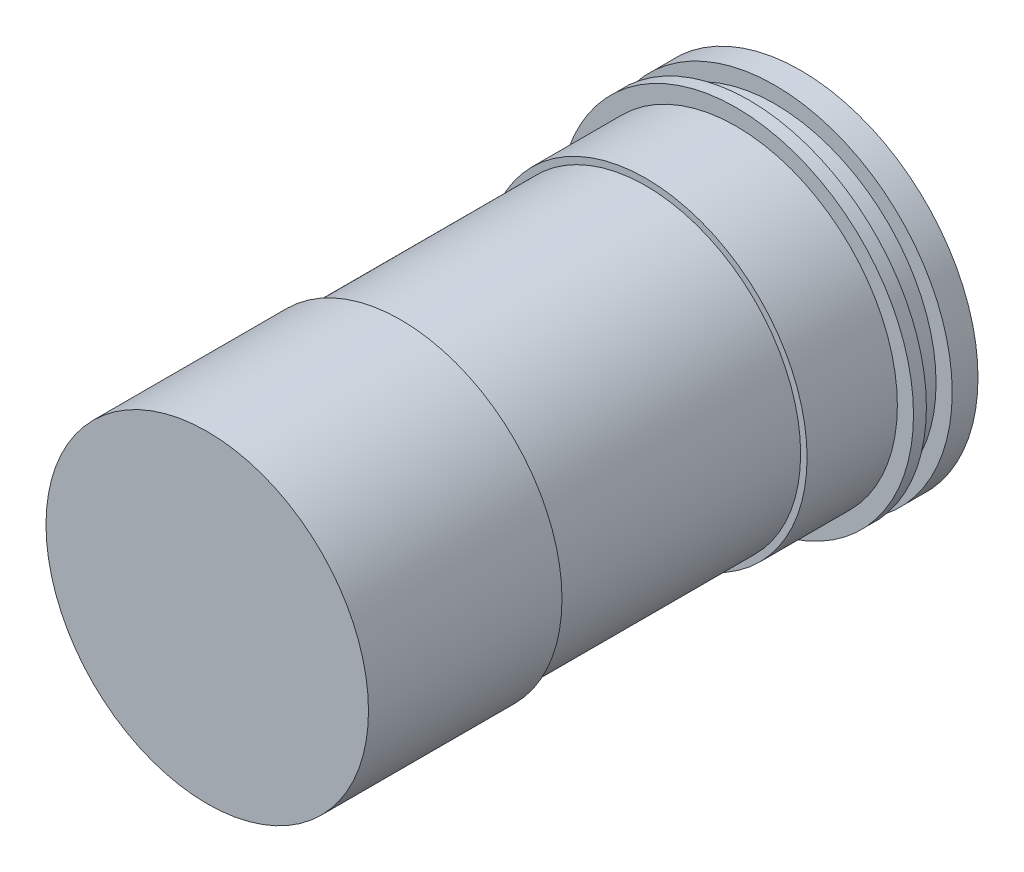
ISO-10303-21;
HEADER;
FILE_DESCRIPTION(('STEP AP214'),'2;1');
FILE_NAME('part.step','',(''),(''),'','','');
FILE_SCHEMA(('AUTOMOTIVE_DESIGN { 1 0 10303 214 1 1 1 1 }'));
ENDSEC;
DATA;
#1=APPLICATION_CONTEXT('core data for automotive mechanical design processes');
#2=APPLICATION_PROTOCOL_DEFINITION('international standard','automotive_design',2000,#1);
#3=PRODUCT_CONTEXT('',#1,'mechanical');
#4=PRODUCT('Part','Part','',(#3));
#5=PRODUCT_RELATED_PRODUCT_CATEGORY('part','',(#4));
#6=PRODUCT_DEFINITION_FORMATION('','',#4);
#7=PRODUCT_DEFINITION_CONTEXT('part definition',#1,'design');
#8=PRODUCT_DEFINITION('design','',#6,#7);
#9=PRODUCT_DEFINITION_SHAPE('','',#8);
#10=(LENGTH_UNIT() NAMED_UNIT(*) SI_UNIT(.MILLI.,.METRE.));
#11=(NAMED_UNIT(*) PLANE_ANGLE_UNIT() SI_UNIT($,.RADIAN.));
#12=(NAMED_UNIT(*) SI_UNIT($,.STERADIAN.) SOLID_ANGLE_UNIT());
#13=UNCERTAINTY_MEASURE_WITH_UNIT(LENGTH_MEASURE(1.E-05),#10,'distance_accuracy_value','');
#14=(GEOMETRIC_REPRESENTATION_CONTEXT(3) GLOBAL_UNCERTAINTY_ASSIGNED_CONTEXT((#13)) GLOBAL_UNIT_ASSIGNED_CONTEXT((#10,
#11,#12)) REPRESENTATION_CONTEXT('',''));
#15=CARTESIAN_POINT('',(0.,0.,0.));
#16=DIRECTION('',(0.,0.,1.));
#17=DIRECTION('',(1.,0.,0.));
#18=AXIS2_PLACEMENT_3D('',#15,#16,#17);
#19=CARTESIAN_POINT('',(0.,0.,3.5));
#20=DIRECTION('',(0.,0.,-1.));
#21=DIRECTION('',(-1.,0.,0.));
#22=AXIS2_PLACEMENT_3D('',#19,#20,#21);
#23=CYLINDRICAL_SURFACE('',#22,12.5);
#24=CARTESIAN_POINT('',(0.,0.,3.5));
#25=DIRECTION('',(0.,0.,1.));
#26=DIRECTION('',(1.,0.,0.));
#27=AXIS2_PLACEMENT_3D('',#24,#25,#26);
#28=CIRCLE('',#27,12.5);
#29=CARTESIAN_POINT('',(12.5,0.,3.5));
#30=VERTEX_POINT('',#29);
#31=EDGE_CURVE('E10',#30,#30,#28,.T.);
#32=ORIENTED_EDGE('',*,*,#31,.F.);
#33=EDGE_LOOP('',(#32));
#34=FACE_BOUND('',#33,.T.);
#35=CARTESIAN_POINT('',(0.,0.,-11.5));
#36=DIRECTION('',(0.,0.,1.));
#37=DIRECTION('',(1.,0.,0.));
#38=AXIS2_PLACEMENT_3D('',#35,#36,#37);
#39=CIRCLE('',#38,12.5);
#40=CARTESIAN_POINT('',(12.5,0.,-11.5));
#41=VERTEX_POINT('',#40);
#42=EDGE_CURVE('E41',#41,#41,#39,.T.);
#43=ORIENTED_EDGE('',*,*,#42,.T.);
#44=EDGE_LOOP('',(#43));
#45=FACE_BOUND('',#44,.T.);
#46=ADVANCED_FACE('F35',(#34,#45),#23,.T.);
#47=CARTESIAN_POINT('',(0.,0.,3.5));
#48=DIRECTION('',(0.,0.,1.));
#49=DIRECTION('',(1.,0.,0.));
#50=AXIS2_PLACEMENT_3D('',#47,#48,#49);
#51=PLANE('',#50);
#52=ORIENTED_EDGE('',*,*,#31,.T.);
#53=EDGE_LOOP('',(#52));
#54=FACE_BOUND('',#53,.T.);
#55=ADVANCED_FACE('F106',(#54),#51,.T.);
#56=CARTESIAN_POINT('',(-12.5,0.,-11.5));
#57=DIRECTION('',(0.,0.,1.));
#58=DIRECTION('',(1.,0.,0.));
#59=AXIS2_PLACEMENT_3D('',#56,#57,#58);
#60=PLANE('',#59);
#61=ORIENTED_EDGE('',*,*,#42,.F.);
#62=EDGE_LOOP('',(#61));
#63=FACE_BOUND('',#62,.T.);
#64=CARTESIAN_POINT('',(0.,0.,-11.5));
#65=DIRECTION('',(0.,0.,1.));
#66=DIRECTION('',(1.,0.,0.));
#67=AXIS2_PLACEMENT_3D('',#64,#65,#66);
#68=CIRCLE('',#67,12.);
#69=CARTESIAN_POINT('',(12.,0.,-11.5));
#70=VERTEX_POINT('',#69);
#71=EDGE_CURVE('E45',#70,#70,#68,.T.);
#72=ORIENTED_EDGE('',*,*,#71,.T.);
#73=EDGE_LOOP('',(#72));
#74=FACE_BOUND('',#73,.T.);
#75=ADVANCED_FACE('F111',(#63,#74),#60,.F.);
#76=CARTESIAN_POINT('',(0.,0.,-3.5));
#77=DIRECTION('',(0.,0.,1.));
#78=DIRECTION('',(1.,0.,0.));
#79=AXIS2_PLACEMENT_3D('',#76,#77,#78);
#80=CYLINDRICAL_SURFACE('',#79,12.);
#81=ORIENTED_EDGE('',*,*,#71,.F.);
#82=EDGE_LOOP('',(#81));
#83=FACE_BOUND('',#82,.T.);
#84=CARTESIAN_POINT('',(0.,0.,-30.5));
#85=DIRECTION('',(0.,0.,1.));
#86=DIRECTION('',(1.,0.,0.));
#87=AXIS2_PLACEMENT_3D('',#84,#85,#86);
#88=CIRCLE('',#87,12.);
#89=CARTESIAN_POINT('',(12.,0.,-30.5));
#90=VERTEX_POINT('',#89);
#91=EDGE_CURVE('E49',#90,#90,#88,.T.);
#92=ORIENTED_EDGE('',*,*,#91,.T.);
#93=EDGE_LOOP('',(#92));
#94=FACE_BOUND('',#93,.T.);
#95=ADVANCED_FACE('F115',(#83,#94),#80,.T.);
#96=CARTESIAN_POINT('',(-12.,0.,-30.5));
#97=DIRECTION('',(0.,0.,-1.));
#98=DIRECTION('',(-1.,0.,0.));
#99=AXIS2_PLACEMENT_3D('',#96,#97,#98);
#100=PLANE('',#99);
#101=ORIENTED_EDGE('',*,*,#91,.F.);
#102=EDGE_LOOP('',(#101));
#103=FACE_BOUND('',#102,.T.);
#104=CARTESIAN_POINT('',(0.,0.,-30.5));
#105=DIRECTION('',(0.,0.,1.));
#106=DIRECTION('',(1.,0.,0.));
#107=AXIS2_PLACEMENT_3D('',#104,#105,#106);
#108=CIRCLE('',#107,12.5);
#109=CARTESIAN_POINT('',(12.5,0.,-30.5));
#110=VERTEX_POINT('',#109);
#111=EDGE_CURVE('E54',#110,#110,#108,.T.);
#112=ORIENTED_EDGE('',*,*,#111,.T.);
#113=EDGE_LOOP('',(#112));
#114=FACE_BOUND('',#113,.T.);
#115=ADVANCED_FACE('F121',(#103,#114),#100,.F.);
#116=CARTESIAN_POINT('',(0.,0.,-3.5));
#117=DIRECTION('',(0.,0.,1.));
#118=DIRECTION('',(1.,0.,0.));
#119=AXIS2_PLACEMENT_3D('',#116,#117,#118);
#120=CYLINDRICAL_SURFACE('',#119,12.5);
#121=ORIENTED_EDGE('',*,*,#111,.F.);
#122=EDGE_LOOP('',(#121));
#123=FACE_BOUND('',#122,.T.);
#124=CARTESIAN_POINT('',(0.,0.,-37.5));
#125=DIRECTION('',(0.,0.,1.));
#126=DIRECTION('',(1.,0.,0.));
#127=AXIS2_PLACEMENT_3D('',#124,#125,#126);
#128=CIRCLE('',#127,12.5);
#129=CARTESIAN_POINT('',(12.5,0.,-37.5));
#130=VERTEX_POINT('',#129);
#131=EDGE_CURVE('E57',#130,#130,#128,.T.);
#132=ORIENTED_EDGE('',*,*,#131,.T.);
#133=EDGE_LOOP('',(#132));
#134=FACE_BOUND('',#133,.T.);
#135=ADVANCED_FACE('F125',(#123,#134),#120,.T.);
#136=CARTESIAN_POINT('',(-12.5,0.,-37.5));
#137=DIRECTION('',(0.,0.,-1.));
#138=DIRECTION('',(-1.,0.,0.));
#139=AXIS2_PLACEMENT_3D('',#136,#137,#138);
#140=PLANE('',#139);
#141=ORIENTED_EDGE('',*,*,#131,.F.);
#142=EDGE_LOOP('',(#141));
#143=FACE_BOUND('',#142,.T.);
#144=CARTESIAN_POINT('',(0.,0.,-37.5));
#145=DIRECTION('',(0.,0.,1.));
#146=DIRECTION('',(1.,0.,0.));
#147=AXIS2_PLACEMENT_3D('',#144,#145,#146);
#148=CIRCLE('',#147,13.75);
#149=CARTESIAN_POINT('',(13.75,0.,-37.5));
#150=VERTEX_POINT('',#149);
#151=EDGE_CURVE('E60',#150,#150,#148,.T.);
#152=ORIENTED_EDGE('',*,*,#151,.T.);
#153=EDGE_LOOP('',(#152));
#154=FACE_BOUND('',#153,.T.);
#155=ADVANCED_FACE('F129',(#143,#154),#140,.F.);
#156=CARTESIAN_POINT('',(0.,0.,-3.5));
#157=DIRECTION('',(0.,0.,1.));
#158=DIRECTION('',(1.,0.,0.));
#159=AXIS2_PLACEMENT_3D('',#156,#157,#158);
#160=CYLINDRICAL_SURFACE('',#159,13.75);
#161=ORIENTED_EDGE('',*,*,#151,.F.);
#162=EDGE_LOOP('',(#161));
#163=FACE_BOUND('',#162,.T.);
#164=CARTESIAN_POINT('',(0.,0.,-38.5));
#165=DIRECTION('',(0.,0.,1.));
#166=DIRECTION('',(1.,0.,0.));
#167=AXIS2_PLACEMENT_3D('',#164,#165,#166);
#168=CIRCLE('',#167,13.75);
#169=CARTESIAN_POINT('',(13.75,0.,-38.5));
#170=VERTEX_POINT('',#169);
#171=EDGE_CURVE('E63',#170,#170,#168,.T.);
#172=ORIENTED_EDGE('',*,*,#171,.T.);
#173=EDGE_LOOP('',(#172));
#174=FACE_BOUND('',#173,.T.);
#175=ADVANCED_FACE('F133',(#163,#174),#160,.T.);
#176=CARTESIAN_POINT('',(-13.75,0.,-38.5));
#177=DIRECTION('',(0.,0.,1.));
#178=DIRECTION('',(1.,0.,0.));
#179=AXIS2_PLACEMENT_3D('',#176,#177,#178);
#180=PLANE('',#179);
#181=ORIENTED_EDGE('',*,*,#171,.F.);
#182=EDGE_LOOP('',(#181));
#183=FACE_BOUND('',#182,.T.);
#184=CARTESIAN_POINT('',(0.,0.,-38.5));
#185=DIRECTION('',(0.,0.,1.));
#186=DIRECTION('',(1.,0.,0.));
#187=AXIS2_PLACEMENT_3D('',#184,#185,#186);
#188=CIRCLE('',#187,12.5);
#189=CARTESIAN_POINT('',(12.5,0.,-38.5));
#190=VERTEX_POINT('',#189);
#191=EDGE_CURVE('E66',#190,#190,#188,.T.);
#192=ORIENTED_EDGE('',*,*,#191,.T.);
#193=EDGE_LOOP('',(#192));
#194=FACE_BOUND('',#193,.T.);
#195=ADVANCED_FACE('F137',(#183,#194),#180,.F.);
#196=CARTESIAN_POINT('',(0.,0.,-3.5));
#197=DIRECTION('',(0.,0.,1.));
#198=DIRECTION('',(1.,0.,0.));
#199=AXIS2_PLACEMENT_3D('',#196,#197,#198);
#200=CYLINDRICAL_SURFACE('',#199,12.5);
#201=ORIENTED_EDGE('',*,*,#191,.F.);
#202=EDGE_LOOP('',(#201));
#203=FACE_BOUND('',#202,.T.);
#204=CARTESIAN_POINT('',(0.,0.,-40.5));
#205=DIRECTION('',(0.,0.,1.));
#206=DIRECTION('',(1.,0.,0.));
#207=AXIS2_PLACEMENT_3D('',#204,#205,#206);
#208=CIRCLE('',#207,12.5);
#209=CARTESIAN_POINT('',(12.5,0.,-40.5));
#210=VERTEX_POINT('',#209);
#211=EDGE_CURVE('E69',#210,#210,#208,.T.);
#212=ORIENTED_EDGE('',*,*,#211,.T.);
#213=EDGE_LOOP('',(#212));
#214=FACE_BOUND('',#213,.T.);
#215=ADVANCED_FACE('F101',(#203,#214),#200,.T.);
#216=CARTESIAN_POINT('',(-12.5,0.,-40.5));
#217=DIRECTION('',(0.,0.,-1.));
#218=DIRECTION('',(-1.,0.,0.));
#219=AXIS2_PLACEMENT_3D('',#216,#217,#218);
#220=PLANE('',#219);
#221=ORIENTED_EDGE('',*,*,#211,.F.);
#222=EDGE_LOOP('',(#221));
#223=FACE_BOUND('',#222,.T.);
#224=CARTESIAN_POINT('',(0.,0.,-40.5));
#225=DIRECTION('',(0.,0.,1.));
#226=DIRECTION('',(1.,0.,0.));
#227=AXIS2_PLACEMENT_3D('',#224,#225,#226);
#228=CIRCLE('',#227,13.75);
#229=CARTESIAN_POINT('',(13.75,0.,-40.5));
#230=VERTEX_POINT('',#229);
#231=EDGE_CURVE('E72',#230,#230,#228,.T.);
#232=ORIENTED_EDGE('',*,*,#231,.T.);
#233=EDGE_LOOP('',(#232));
#234=FACE_BOUND('',#233,.T.);
#235=ADVANCED_FACE('F95',(#223,#234),#220,.F.);
#236=CARTESIAN_POINT('',(0.,0.,-3.5));
#237=DIRECTION('',(0.,0.,1.));
#238=DIRECTION('',(1.,0.,0.));
#239=AXIS2_PLACEMENT_3D('',#236,#237,#238);
#240=CYLINDRICAL_SURFACE('',#239,13.75);
#241=ORIENTED_EDGE('',*,*,#231,.F.);
#242=EDGE_LOOP('',(#241));
#243=FACE_BOUND('',#242,.T.);
#244=CARTESIAN_POINT('',(0.,0.,-42.5));
#245=DIRECTION('',(0.,0.,1.));
#246=DIRECTION('',(1.,0.,0.));
#247=AXIS2_PLACEMENT_3D('',#244,#245,#246);
#248=CIRCLE('',#247,13.75);
#249=CARTESIAN_POINT('',(13.75,0.,-42.5));
#250=VERTEX_POINT('',#249);
#251=EDGE_CURVE('E75',#250,#250,#248,.T.);
#252=ORIENTED_EDGE('',*,*,#251,.T.);
#253=EDGE_LOOP('',(#252));
#254=FACE_BOUND('',#253,.T.);
#255=ADVANCED_FACE('F90',(#243,#254),#240,.T.);
#256=CARTESIAN_POINT('',(-13.75,0.,-42.5));
#257=DIRECTION('',(0.,0.,1.));
#258=DIRECTION('',(1.,0.,0.));
#259=AXIS2_PLACEMENT_3D('',#256,#257,#258);
#260=PLANE('',#259);
#261=CARTESIAN_POINT('',(0.,0.,-42.5));
#262=DIRECTION('',(0.,0.,-1.));
#263=DIRECTION('',(-1.,0.,0.));
#264=AXIS2_PLACEMENT_3D('',#261,#262,#263);
#265=CIRCLE('',#264,9.75);
#266=CARTESIAN_POINT('',(-9.75000000000001,0.,-42.5));
#267=VERTEX_POINT('',#266);
#268=EDGE_CURVE('E81',#267,#267,#265,.T.);
#269=ORIENTED_EDGE('',*,*,#268,.F.);
#270=EDGE_LOOP('',(#269));
#271=FACE_BOUND('',#270,.T.);
#272=ORIENTED_EDGE('',*,*,#251,.F.);
#273=EDGE_LOOP('',(#272));
#274=FACE_BOUND('',#273,.T.);
#275=ADVANCED_FACE('F87',(#271,#274),#260,.F.);
#276=CARTESIAN_POINT('',(0.,0.,-42.5));
#277=DIRECTION('',(0.,0.,-1.));
#278=DIRECTION('',(-1.,0.,0.));
#279=AXIS2_PLACEMENT_3D('',#276,#277,#278);
#280=CONICAL_SURFACE('',#279,9.75,0.78539816339745);
#281=CARTESIAN_POINT('',(0.,0.,-37.5));
#282=DIRECTION('',(0.,0.,-1.));
#283=DIRECTION('',(-1.,0.,0.));
#284=AXIS2_PLACEMENT_3D('',#281,#282,#283);
#285=CIRCLE('',#284,4.74999999999998);
#286=CARTESIAN_POINT('',(-4.74999999999999,0.,-37.5));
#287=VERTEX_POINT('',#286);
#288=EDGE_CURVE('E78',#287,#287,#285,.T.);
#289=ORIENTED_EDGE('',*,*,#288,.F.);
#290=EDGE_LOOP('',(#289));
#291=FACE_BOUND('',#290,.T.);
#292=ORIENTED_EDGE('',*,*,#268,.T.);
#293=EDGE_LOOP('',(#292));
#294=FACE_BOUND('',#293,.T.);
#295=ADVANCED_FACE('F85',(#291,#294),#280,.F.);
#296=CARTESIAN_POINT('',(0.,0.,-37.5));
#297=DIRECTION('',(0.,0.,1.));
#298=DIRECTION('',(-1.,0.,0.));
#299=AXIS2_PLACEMENT_3D('',#296,#297,#298);
#300=SPHERICAL_SURFACE('',#299,4.74999999999999);
#301=ORIENTED_EDGE('',*,*,#288,.T.);
#302=EDGE_LOOP('',(#301));
#303=FACE_BOUND('',#302,.T.);
#304=ADVANCED_FACE('F176',(#303),#300,.T.);
#305=CLOSED_SHELL('',(#46,#55,#75,#95,#115,#135,#155,#175,#195,#215,#235,#255,#275,#295,#304));
#306=MANIFOLD_SOLID_BREP('B2',#305);
#307=ADVANCED_BREP_SHAPE_REPRESENTATION('',(#18,#306),#14);
#308=SHAPE_DEFINITION_REPRESENTATION(#9,#307);
ENDSEC;
END-ISO-10303-21;
